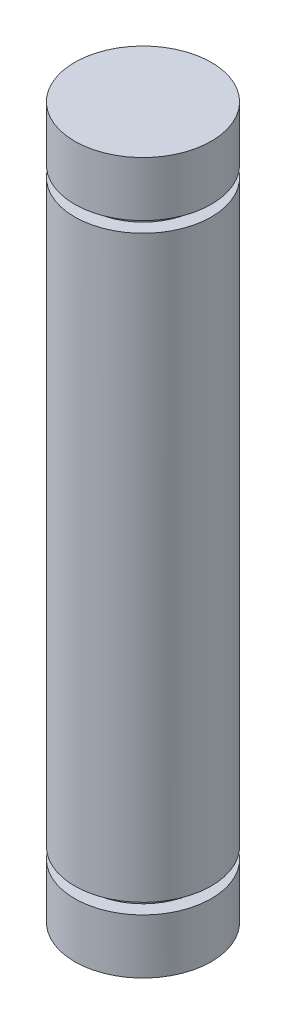
ISO-10303-21;
HEADER;
FILE_DESCRIPTION(('STEP AP214'),'2;1');
FILE_NAME('part.step','',(''),(''),'','','');
FILE_SCHEMA(('AUTOMOTIVE_DESIGN { 1 0 10303 214 1 1 1 1 }'));
ENDSEC;
DATA;
#1=APPLICATION_CONTEXT('core data for automotive mechanical design processes');
#2=APPLICATION_PROTOCOL_DEFINITION('international standard','automotive_design',2000,#1);
#3=PRODUCT_CONTEXT('',#1,'mechanical');
#4=PRODUCT('Part','Part','',(#3));
#5=PRODUCT_RELATED_PRODUCT_CATEGORY('part','',(#4));
#6=PRODUCT_DEFINITION_FORMATION('','',#4);
#7=PRODUCT_DEFINITION_CONTEXT('part definition',#1,'design');
#8=PRODUCT_DEFINITION('design','',#6,#7);
#9=PRODUCT_DEFINITION_SHAPE('','',#8);
#10=(LENGTH_UNIT() NAMED_UNIT(*) SI_UNIT(.MILLI.,.METRE.));
#11=(NAMED_UNIT(*) PLANE_ANGLE_UNIT() SI_UNIT($,.RADIAN.));
#12=(NAMED_UNIT(*) SI_UNIT($,.STERADIAN.) SOLID_ANGLE_UNIT());
#13=UNCERTAINTY_MEASURE_WITH_UNIT(LENGTH_MEASURE(1.E-05),#10,'distance_accuracy_value','');
#14=(GEOMETRIC_REPRESENTATION_CONTEXT(3) GLOBAL_UNCERTAINTY_ASSIGNED_CONTEXT((#13)) GLOBAL_UNIT_ASSIGNED_CONTEXT((#10,
#11,#12)) REPRESENTATION_CONTEXT('',''));
#15=CARTESIAN_POINT('',(0.,0.,0.));
#16=DIRECTION('',(0.,0.,1.));
#17=DIRECTION('',(1.,0.,0.));
#18=AXIS2_PLACEMENT_3D('',#15,#16,#17);
#19=CARTESIAN_POINT('',(0.,16.51,0.));
#20=DIRECTION('',(0.,-1.,0.));
#21=DIRECTION('',(0.,0.,-1.));
#22=AXIS2_PLACEMENT_3D('',#19,#20,#21);
#23=CYLINDRICAL_SURFACE('',#22,1.5875);
#24=CARTESIAN_POINT('',(0.,1.524,0.));
#25=DIRECTION('',(0.,-1.,0.));
#26=DIRECTION('',(0.,0.,-1.));
#27=AXIS2_PLACEMENT_3D('',#24,#25,#26);
#28=CIRCLE('',#27,1.5875);
#29=CARTESIAN_POINT('',(0.,1.524,-1.5875));
#30=VERTEX_POINT('',#29);
#31=EDGE_CURVE('E72',#30,#30,#28,.T.);
#32=ORIENTED_EDGE('',*,*,#31,.F.);
#33=EDGE_LOOP('',(#32));
#34=FACE_BOUND('',#33,.T.);
#35=CARTESIAN_POINT('',(0.,14.986,0.));
#36=DIRECTION('',(0.,1.,0.));
#37=DIRECTION('',(0.,0.,1.));
#38=AXIS2_PLACEMENT_3D('',#35,#36,#37);
#39=CIRCLE('',#38,1.5875);
#40=CARTESIAN_POINT('',(0.,14.986,1.5875));
#41=VERTEX_POINT('',#40);
#42=EDGE_CURVE('E61',#41,#41,#39,.T.);
#43=ORIENTED_EDGE('',*,*,#42,.F.);
#44=EDGE_LOOP('',(#43));
#45=FACE_BOUND('',#44,.T.);
#46=ADVANCED_FACE('F57',(#34,#45),#23,.T.);
#47=CARTESIAN_POINT('',(0.,1.524,0.));
#48=DIRECTION('',(0.,-1.,0.));
#49=DIRECTION('',(0.,0.,-1.));
#50=AXIS2_PLACEMENT_3D('',#47,#48,#49);
#51=PLANE('',#50);
#52=CARTESIAN_POINT('',(0.,1.524,0.));
#53=DIRECTION('',(0.,-1.,0.));
#54=DIRECTION('',(0.,0.,-1.));
#55=AXIS2_PLACEMENT_3D('',#52,#53,#54);
#56=CIRCLE('',#55,1.27);
#57=CARTESIAN_POINT('',(0.,1.524,-1.27));
#58=VERTEX_POINT('',#57);
#59=EDGE_CURVE('E82',#58,#58,#56,.T.);
#60=ORIENTED_EDGE('',*,*,#59,.F.);
#61=EDGE_LOOP('',(#60));
#62=FACE_BOUND('',#61,.T.);
#63=ORIENTED_EDGE('',*,*,#31,.T.);
#64=EDGE_LOOP('',(#63));
#65=FACE_BOUND('',#64,.T.);
#66=ADVANCED_FACE('F123',(#62,#65),#51,.T.);
#67=CARTESIAN_POINT('',(0.,1.27,0.));
#68=DIRECTION('',(0.,-1.,0.));
#69=DIRECTION('',(0.,0.,-1.));
#70=AXIS2_PLACEMENT_3D('',#67,#68,#69);
#71=PLANE('',#70);
#72=CARTESIAN_POINT('',(0.,1.27,0.));
#73=DIRECTION('',(0.,-1.,0.));
#74=DIRECTION('',(0.,0.,-1.));
#75=AXIS2_PLACEMENT_3D('',#72,#73,#74);
#76=CIRCLE('',#75,1.27);
#77=CARTESIAN_POINT('',(0.,1.27,-1.27));
#78=VERTEX_POINT('',#77);
#79=EDGE_CURVE('E75',#78,#78,#76,.T.);
#80=ORIENTED_EDGE('',*,*,#79,.T.);
#81=EDGE_LOOP('',(#80));
#82=FACE_BOUND('',#81,.T.);
#83=CARTESIAN_POINT('',(0.,1.27,0.));
#84=DIRECTION('',(0.,-1.,0.));
#85=DIRECTION('',(0.,0.,-1.));
#86=AXIS2_PLACEMENT_3D('',#83,#84,#85);
#87=CIRCLE('',#86,1.5875);
#88=CARTESIAN_POINT('',(0.,1.27,-1.5875));
#89=VERTEX_POINT('',#88);
#90=EDGE_CURVE('E78',#89,#89,#87,.T.);
#91=ORIENTED_EDGE('',*,*,#90,.F.);
#92=EDGE_LOOP('',(#91));
#93=FACE_BOUND('',#92,.T.);
#94=ADVANCED_FACE('F110',(#82,#93),#71,.F.);
#95=CARTESIAN_POINT('',(0.,1.524,0.));
#96=DIRECTION('',(0.,-1.,0.));
#97=DIRECTION('',(0.,0.,-1.));
#98=AXIS2_PLACEMENT_3D('',#95,#96,#97);
#99=CYLINDRICAL_SURFACE('',#98,1.27);
#100=ORIENTED_EDGE('',*,*,#59,.T.);
#101=EDGE_LOOP('',(#100));
#102=FACE_BOUND('',#101,.T.);
#103=ORIENTED_EDGE('',*,*,#79,.F.);
#104=EDGE_LOOP('',(#103));
#105=FACE_BOUND('',#104,.T.);
#106=ADVANCED_FACE('F113',(#102,#105),#99,.T.);
#107=CARTESIAN_POINT('',(0.,0.,0.));
#108=DIRECTION('',(0.,1.,0.));
#109=DIRECTION('',(0.,0.,1.));
#110=AXIS2_PLACEMENT_3D('',#107,#108,#109);
#111=PLANE('',#110);
#112=CARTESIAN_POINT('',(0.,0.,0.));
#113=DIRECTION('',(0.,1.,0.));
#114=DIRECTION('',(0.,0.,1.));
#115=AXIS2_PLACEMENT_3D('',#112,#113,#114);
#116=CIRCLE('',#115,1.5875);
#117=CARTESIAN_POINT('',(0.,0.,1.5875));
#118=VERTEX_POINT('',#117);
#119=EDGE_CURVE('E66',#118,#118,#116,.T.);
#120=ORIENTED_EDGE('',*,*,#119,.F.);
#121=EDGE_LOOP('',(#120));
#122=FACE_BOUND('',#121,.T.);
#123=ADVANCED_FACE('F115',(#122),#111,.F.);
#124=ORIENTED_EDGE('',*,*,#90,.T.);
#125=EDGE_LOOP('',(#124));
#126=FACE_BOUND('',#125,.T.);
#127=ORIENTED_EDGE('',*,*,#119,.T.);
#128=EDGE_LOOP('',(#127));
#129=FACE_BOUND('',#128,.T.);
#130=ADVANCED_FACE('F59',(#126,#129),#23,.T.);
#131=CARTESIAN_POINT('',(0.,14.986,0.));
#132=DIRECTION('',(0.,1.,0.));
#133=DIRECTION('',(0.,0.,-1.));
#134=AXIS2_PLACEMENT_3D('',#131,#132,#133);
#135=PLANE('',#134);
#136=CARTESIAN_POINT('',(0.,14.986,0.));
#137=DIRECTION('',(0.,-1.,0.));
#138=DIRECTION('',(0.,0.,-1.));
#139=AXIS2_PLACEMENT_3D('',#136,#137,#138);
#140=CIRCLE('',#139,1.27);
#141=CARTESIAN_POINT('',(0.,14.986,-1.27));
#142=VERTEX_POINT('',#141);
#143=EDGE_CURVE('E88',#142,#142,#140,.T.);
#144=ORIENTED_EDGE('',*,*,#143,.T.);
#145=EDGE_LOOP('',(#144));
#146=FACE_BOUND('',#145,.T.);
#147=ORIENTED_EDGE('',*,*,#42,.T.);
#148=EDGE_LOOP('',(#147));
#149=FACE_BOUND('',#148,.T.);
#150=ADVANCED_FACE('F137',(#146,#149),#135,.T.);
#151=CARTESIAN_POINT('',(0.,15.24,0.));
#152=DIRECTION('',(0.,1.,0.));
#153=DIRECTION('',(0.,0.,-1.));
#154=AXIS2_PLACEMENT_3D('',#151,#152,#153);
#155=PLANE('',#154);
#156=CARTESIAN_POINT('',(0.,15.24,0.));
#157=DIRECTION('',(0.,-1.,0.));
#158=DIRECTION('',(0.,0.,-1.));
#159=AXIS2_PLACEMENT_3D('',#156,#157,#158);
#160=CIRCLE('',#159,1.27);
#161=CARTESIAN_POINT('',(0.,15.24,-1.27));
#162=VERTEX_POINT('',#161);
#163=EDGE_CURVE('E95',#162,#162,#160,.T.);
#164=ORIENTED_EDGE('',*,*,#163,.F.);
#165=EDGE_LOOP('',(#164));
#166=FACE_BOUND('',#165,.T.);
#167=CARTESIAN_POINT('',(0.,15.24,0.));
#168=DIRECTION('',(0.,1.,0.));
#169=DIRECTION('',(0.,0.,1.));
#170=AXIS2_PLACEMENT_3D('',#167,#168,#169);
#171=CIRCLE('',#170,1.5875);
#172=CARTESIAN_POINT('',(0.,15.24,1.5875));
#173=VERTEX_POINT('',#172);
#174=EDGE_CURVE('E85',#173,#173,#171,.T.);
#175=ORIENTED_EDGE('',*,*,#174,.F.);
#176=EDGE_LOOP('',(#175));
#177=FACE_BOUND('',#176,.T.);
#178=ADVANCED_FACE('F142',(#166,#177),#155,.F.);
#179=CARTESIAN_POINT('',(0.,14.986,0.));
#180=DIRECTION('',(0.,1.,0.));
#181=DIRECTION('',(0.,0.,1.));
#182=AXIS2_PLACEMENT_3D('',#179,#180,#181);
#183=CYLINDRICAL_SURFACE('',#182,1.27);
#184=ORIENTED_EDGE('',*,*,#143,.F.);
#185=EDGE_LOOP('',(#184));
#186=FACE_BOUND('',#185,.T.);
#187=ORIENTED_EDGE('',*,*,#163,.T.);
#188=EDGE_LOOP('',(#187));
#189=FACE_BOUND('',#188,.T.);
#190=ADVANCED_FACE('F150',(#186,#189),#183,.T.);
#191=CARTESIAN_POINT('',(0.,16.51,0.));
#192=DIRECTION('',(0.,1.,0.));
#193=DIRECTION('',(0.,0.,1.));
#194=AXIS2_PLACEMENT_3D('',#191,#192,#193);
#195=PLANE('',#194);
#196=CARTESIAN_POINT('',(0.,16.51,0.));
#197=DIRECTION('',(0.,1.,0.));
#198=DIRECTION('',(0.,0.,1.));
#199=AXIS2_PLACEMENT_3D('',#196,#197,#198);
#200=CIRCLE('',#199,1.5875);
#201=CARTESIAN_POINT('',(0.,16.51,1.5875));
#202=VERTEX_POINT('',#201);
#203=EDGE_CURVE('E11',#202,#202,#200,.T.);
#204=ORIENTED_EDGE('',*,*,#203,.T.);
#205=EDGE_LOOP('',(#204));
#206=FACE_BOUND('',#205,.T.);
#207=ADVANCED_FACE('F136',(#206),#195,.T.);
#208=ORIENTED_EDGE('',*,*,#174,.T.);
#209=EDGE_LOOP('',(#208));
#210=FACE_BOUND('',#209,.T.);
#211=ORIENTED_EDGE('',*,*,#203,.F.);
#212=EDGE_LOOP('',(#211));
#213=FACE_BOUND('',#212,.T.);
#214=ADVANCED_FACE('F129',(#210,#213),#23,.T.);
#215=CLOSED_SHELL('',(#46,#66,#94,#106,#123,#130,#150,#178,#190,#207,#214));
#216=MANIFOLD_SOLID_BREP('B2',#215);
#217=ADVANCED_BREP_SHAPE_REPRESENTATION('',(#18,#216),#14);
#218=SHAPE_DEFINITION_REPRESENTATION(#9,#217);
ENDSEC;
END-ISO-10303-21;
